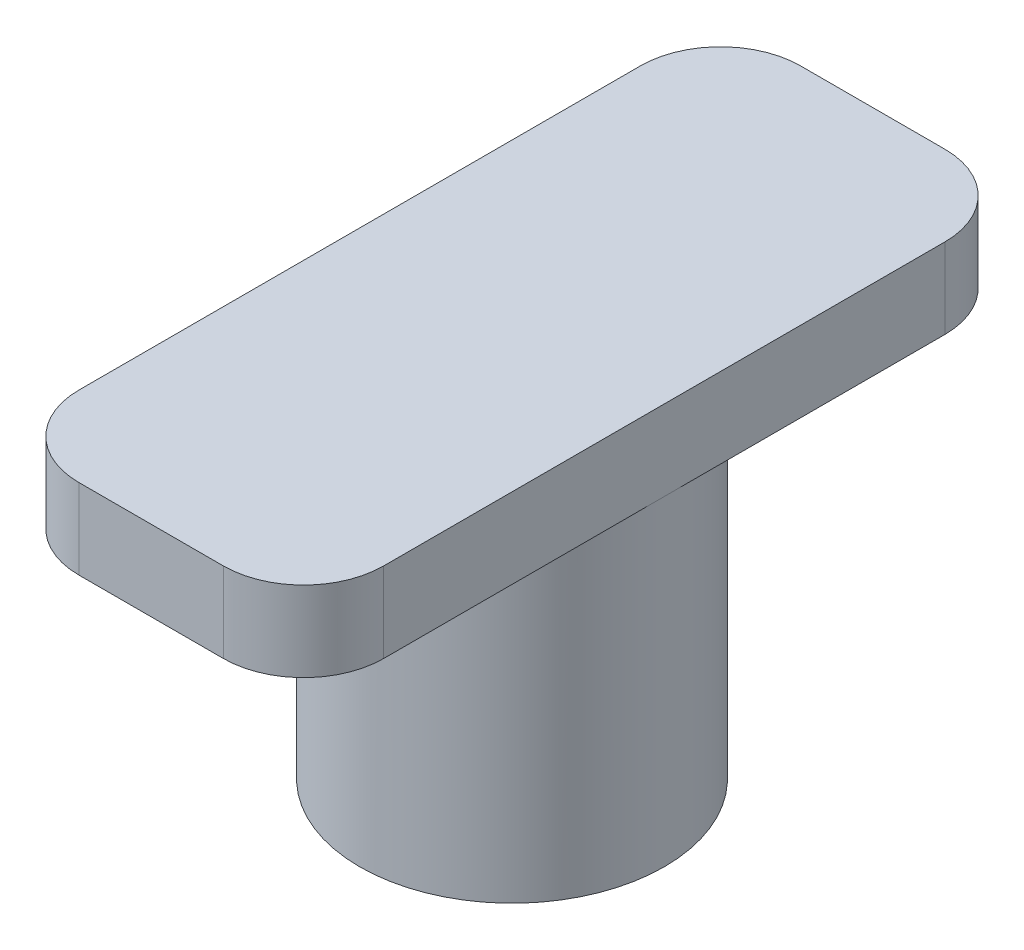
ISO-10303-21;
HEADER;
FILE_DESCRIPTION(('STEP AP214'),'2;1');
FILE_NAME('part.step','',(''),(''),'','','');
FILE_SCHEMA(('AUTOMOTIVE_DESIGN { 1 0 10303 214 1 1 1 1 }'));
ENDSEC;
DATA;
#1=APPLICATION_CONTEXT('core data for automotive mechanical design processes');
#2=APPLICATION_PROTOCOL_DEFINITION('international standard','automotive_design',2000,#1);
#3=PRODUCT_CONTEXT('',#1,'mechanical');
#4=PRODUCT('Part','Part','',(#3));
#5=PRODUCT_RELATED_PRODUCT_CATEGORY('part','',(#4));
#6=PRODUCT_DEFINITION_FORMATION('','',#4);
#7=PRODUCT_DEFINITION_CONTEXT('part definition',#1,'design');
#8=PRODUCT_DEFINITION('design','',#6,#7);
#9=PRODUCT_DEFINITION_SHAPE('','',#8);
#10=(LENGTH_UNIT() NAMED_UNIT(*) SI_UNIT(.MILLI.,.METRE.));
#11=(NAMED_UNIT(*) PLANE_ANGLE_UNIT() SI_UNIT($,.RADIAN.));
#12=(NAMED_UNIT(*) SI_UNIT($,.STERADIAN.) SOLID_ANGLE_UNIT());
#13=UNCERTAINTY_MEASURE_WITH_UNIT(LENGTH_MEASURE(1.E-05),#10,'distance_accuracy_value','');
#14=(GEOMETRIC_REPRESENTATION_CONTEXT(3) GLOBAL_UNCERTAINTY_ASSIGNED_CONTEXT((#13)) GLOBAL_UNIT_ASSIGNED_CONTEXT((#10,
#11,#12)) REPRESENTATION_CONTEXT('',''));
#15=CARTESIAN_POINT('',(0.,0.,0.));
#16=DIRECTION('',(0.,0.,1.));
#17=DIRECTION('',(1.,0.,0.));
#18=AXIS2_PLACEMENT_3D('',#15,#16,#17);
#19=CARTESIAN_POINT('',(0.,80.,0.));
#20=DIRECTION('',(0.,-1.,0.));
#21=DIRECTION('',(0.,0.,-1.));
#22=AXIS2_PLACEMENT_3D('',#19,#20,#21);
#23=CYLINDRICAL_SURFACE('',#22,38.);
#24=CARTESIAN_POINT('',(0.,80.,0.));
#25=DIRECTION('',(0.,1.,0.));
#26=DIRECTION('',(0.,0.,1.));
#27=AXIS2_PLACEMENT_3D('',#24,#25,#26);
#28=CIRCLE('',#27,38.);
#29=CARTESIAN_POINT('',(38.,80.,0.));
#30=VERTEX_POINT('',#29);
#31=CARTESIAN_POINT('',(-38.,80.,0.));
#32=VERTEX_POINT('',#31);
#33=EDGE_CURVE('E11',#30,#32,#28,.T.);
#34=ORIENTED_EDGE('',*,*,#33,.F.);
#35=EDGE_CURVE('E41',#32,#30,#28,.T.);
#36=ORIENTED_EDGE('',*,*,#35,.F.);
#37=EDGE_LOOP('',(#34,#36));
#38=FACE_BOUND('',#37,.T.);
#39=CARTESIAN_POINT('',(0.,0.,0.));
#40=DIRECTION('',(0.,1.,0.));
#41=DIRECTION('',(0.,0.,1.));
#42=AXIS2_PLACEMENT_3D('',#39,#40,#41);
#43=CIRCLE('',#42,38.);
#44=CARTESIAN_POINT('',(0.,0.,38.));
#45=VERTEX_POINT('',#44);
#46=EDGE_CURVE('E36',#45,#45,#43,.T.);
#47=ORIENTED_EDGE('',*,*,#46,.T.);
#48=EDGE_LOOP('',(#47));
#49=FACE_BOUND('',#48,.T.);
#50=ADVANCED_FACE('F33',(#38,#49),#23,.T.);
#51=CARTESIAN_POINT('',(0.,0.,0.));
#52=DIRECTION('',(0.,1.,0.));
#53=DIRECTION('',(0.,0.,1.));
#54=AXIS2_PLACEMENT_3D('',#51,#52,#53);
#55=PLANE('',#54);
#56=CARTESIAN_POINT('',(0.,0.,0.));
#57=DIRECTION('',(0.,-1.,0.));
#58=DIRECTION('',(0.,0.,-1.));
#59=AXIS2_PLACEMENT_3D('',#56,#57,#58);
#60=CIRCLE('',#59,29.);
#61=CARTESIAN_POINT('',(0.,0.,-29.));
#62=VERTEX_POINT('',#61);
#63=EDGE_CURVE('E124',#62,#62,#60,.T.);
#64=ORIENTED_EDGE('',*,*,#63,.F.);
#65=EDGE_LOOP('',(#64));
#66=FACE_BOUND('',#65,.T.);
#67=ORIENTED_EDGE('',*,*,#46,.F.);
#68=EDGE_LOOP('',(#67));
#69=FACE_BOUND('',#68,.T.);
#70=ADVANCED_FACE('F222',(#66,#69),#55,.F.);
#71=CARTESIAN_POINT('',(0.,75.,0.));
#72=DIRECTION('',(0.,-1.,0.));
#73=DIRECTION('',(0.,0.,-1.));
#74=AXIS2_PLACEMENT_3D('',#71,#72,#73);
#75=CYLINDRICAL_SURFACE('',#74,29.);
#76=CARTESIAN_POINT('',(0.,75.,0.));
#77=DIRECTION('',(0.,-1.,0.));
#78=DIRECTION('',(0.,0.,-1.));
#79=AXIS2_PLACEMENT_3D('',#76,#77,#78);
#80=CIRCLE('',#79,29.);
#81=CARTESIAN_POINT('',(0.,75.,-29.));
#82=VERTEX_POINT('',#81);
#83=EDGE_CURVE('E127',#82,#82,#80,.T.);
#84=ORIENTED_EDGE('',*,*,#83,.F.);
#85=EDGE_LOOP('',(#84));
#86=FACE_BOUND('',#85,.T.);
#87=ORIENTED_EDGE('',*,*,#63,.T.);
#88=EDGE_LOOP('',(#87));
#89=FACE_BOUND('',#88,.T.);
#90=ADVANCED_FACE('F226',(#86,#89),#75,.F.);
#91=CARTESIAN_POINT('',(0.,75.,0.));
#92=DIRECTION('',(0.,-1.,0.));
#93=DIRECTION('',(0.,0.,-1.));
#94=AXIS2_PLACEMENT_3D('',#91,#92,#93);
#95=PLANE('',#94);
#96=ORIENTED_EDGE('',*,*,#83,.T.);
#97=EDGE_LOOP('',(#96));
#98=FACE_BOUND('',#97,.T.);
#99=ADVANCED_FACE('F231',(#98),#95,.T.);
#100=CARTESIAN_POINT('',(18.,80.,70.));
#101=DIRECTION('',(0.,1.,0.));
#102=DIRECTION('',(0.,0.,1.));
#103=AXIS2_PLACEMENT_3D('',#100,#101,#102);
#104=PLANE('',#103);
#105=DIRECTION('',(0.,0.,-1.));
#106=VECTOR('',#105,1.);
#107=CARTESIAN_POINT('',(38.,80.,70.));
#108=LINE('',#107,#106);
#109=CARTESIAN_POINT('',(38.,80.,-70.));
#110=VERTEX_POINT('',#109);
#111=EDGE_CURVE('E149',#30,#110,#108,.T.);
#112=ORIENTED_EDGE('',*,*,#111,.F.);
#113=ORIENTED_EDGE('',*,*,#33,.T.);
#114=DIRECTION('',(0.,0.,-1.));
#115=VECTOR('',#114,1.);
#116=CARTESIAN_POINT('',(-38.,80.,70.));
#117=LINE('',#116,#115);
#118=CARTESIAN_POINT('',(-38.,80.,-70.));
#119=VERTEX_POINT('',#118);
#120=EDGE_CURVE('E164',#32,#119,#117,.T.);
#121=ORIENTED_EDGE('',*,*,#120,.T.);
#122=CARTESIAN_POINT('',(-18.,80.,-70.));
#123=DIRECTION('',(0.,1.,0.));
#124=DIRECTION('',(0.,0.,1.));
#125=AXIS2_PLACEMENT_3D('',#122,#123,#124);
#126=CIRCLE('',#125,20.);
#127=CARTESIAN_POINT('',(-18.,80.,-90.));
#128=VERTEX_POINT('',#127);
#129=EDGE_CURVE('E161',#128,#119,#126,.T.);
#130=ORIENTED_EDGE('',*,*,#129,.F.);
#131=DIRECTION('',(-1.,0.,0.));
#132=VECTOR('',#131,1.);
#133=CARTESIAN_POINT('',(18.,80.,-90.));
#134=LINE('',#133,#132);
#135=CARTESIAN_POINT('',(18.,80.,-90.));
#136=VERTEX_POINT('',#135);
#137=EDGE_CURVE('E155',#136,#128,#134,.T.);
#138=ORIENTED_EDGE('',*,*,#137,.F.);
#139=CARTESIAN_POINT('',(18.,80.,-70.));
#140=DIRECTION('',(0.,1.,0.));
#141=DIRECTION('',(0.,0.,1.));
#142=AXIS2_PLACEMENT_3D('',#139,#140,#141);
#143=CIRCLE('',#142,20.);
#144=EDGE_CURVE('E153',#110,#136,#143,.T.);
#145=ORIENTED_EDGE('',*,*,#144,.F.);
#146=EDGE_LOOP('',(#112,#113,#121,#130,#138,#145));
#147=FACE_BOUND('',#146,.T.);
#148=ADVANCED_FACE('F150',(#147),#104,.F.);
#149=CARTESIAN_POINT('',(-38.,80.,70.));
#150=VERTEX_POINT('',#149);
#151=EDGE_CURVE('E146',#150,#32,#117,.T.);
#152=ORIENTED_EDGE('',*,*,#151,.T.);
#153=ORIENTED_EDGE('',*,*,#35,.T.);
#154=CARTESIAN_POINT('',(38.,80.,70.));
#155=VERTEX_POINT('',#154);
#156=EDGE_CURVE('E143',#155,#30,#108,.T.);
#157=ORIENTED_EDGE('',*,*,#156,.F.);
#158=CARTESIAN_POINT('',(18.,80.,70.));
#159=DIRECTION('',(0.,1.,0.));
#160=DIRECTION('',(0.,0.,1.));
#161=AXIS2_PLACEMENT_3D('',#158,#159,#160);
#162=CIRCLE('',#161,20.);
#163=CARTESIAN_POINT('',(18.,80.,90.));
#164=VERTEX_POINT('',#163);
#165=EDGE_CURVE('E123',#164,#155,#162,.T.);
#166=ORIENTED_EDGE('',*,*,#165,.F.);
#167=DIRECTION('',(-1.,0.,0.));
#168=VECTOR('',#167,1.);
#169=CARTESIAN_POINT('',(18.,80.,90.));
#170=LINE('',#169,#168);
#171=CARTESIAN_POINT('',(-18.,80.,90.));
#172=VERTEX_POINT('',#171);
#173=EDGE_CURVE('E119',#164,#172,#170,.T.);
#174=ORIENTED_EDGE('',*,*,#173,.T.);
#175=CARTESIAN_POINT('',(-18.,80.,70.));
#176=DIRECTION('',(0.,-1.,0.));
#177=DIRECTION('',(0.,0.,-1.));
#178=AXIS2_PLACEMENT_3D('',#175,#176,#177);
#179=CIRCLE('',#178,20.);
#180=EDGE_CURVE('E166',#172,#150,#179,.T.);
#181=ORIENTED_EDGE('',*,*,#180,.T.);
#182=EDGE_LOOP('',(#152,#153,#157,#166,#174,#181));
#183=FACE_BOUND('',#182,.T.);
#184=ADVANCED_FACE('F142',(#183),#104,.F.);
#185=CARTESIAN_POINT('',(18.,100.,70.));
#186=DIRECTION('',(0.,-1.,0.));
#187=DIRECTION('',(0.,0.,-1.));
#188=AXIS2_PLACEMENT_3D('',#185,#186,#187);
#189=CYLINDRICAL_SURFACE('',#188,20.);
#190=ORIENTED_EDGE('',*,*,#165,.T.);
#191=DIRECTION('',(0.,-1.,0.));
#192=VECTOR('',#191,1.);
#193=CARTESIAN_POINT('',(38.,100.,70.));
#194=LINE('',#193,#192);
#195=CARTESIAN_POINT('',(38.,100.,70.));
#196=VERTEX_POINT('',#195);
#197=EDGE_CURVE('E103',#196,#155,#194,.T.);
#198=ORIENTED_EDGE('',*,*,#197,.F.);
#199=CARTESIAN_POINT('',(18.,100.,70.));
#200=DIRECTION('',(0.,1.,0.));
#201=DIRECTION('',(0.,0.,1.));
#202=AXIS2_PLACEMENT_3D('',#199,#200,#201);
#203=CIRCLE('',#202,20.);
#204=CARTESIAN_POINT('',(18.,100.,90.));
#205=VERTEX_POINT('',#204);
#206=EDGE_CURVE('E110',#205,#196,#203,.T.);
#207=ORIENTED_EDGE('',*,*,#206,.F.);
#208=DIRECTION('',(0.,-1.,0.));
#209=VECTOR('',#208,1.);
#210=CARTESIAN_POINT('',(18.,100.,90.));
#211=LINE('',#210,#209);
#212=EDGE_CURVE('E170',#205,#164,#211,.T.);
#213=ORIENTED_EDGE('',*,*,#212,.T.);
#214=EDGE_LOOP('',(#190,#198,#207,#213));
#215=FACE_BOUND('',#214,.T.);
#216=ADVANCED_FACE('F121',(#215),#189,.T.);
#217=CARTESIAN_POINT('',(38.,100.,70.));
#218=DIRECTION('',(-1.,0.,0.));
#219=DIRECTION('',(0.,0.,1.));
#220=AXIS2_PLACEMENT_3D('',#217,#218,#219);
#221=PLANE('',#220);
#222=ORIENTED_EDGE('',*,*,#156,.T.);
#223=ORIENTED_EDGE('',*,*,#111,.T.);
#224=DIRECTION('',(0.,-1.,0.));
#225=VECTOR('',#224,1.);
#226=CARTESIAN_POINT('',(38.,100.,-70.));
#227=LINE('',#226,#225);
#228=CARTESIAN_POINT('',(38.,100.,-70.));
#229=VERTEX_POINT('',#228);
#230=EDGE_CURVE('E106',#229,#110,#227,.T.);
#231=ORIENTED_EDGE('',*,*,#230,.F.);
#232=DIRECTION('',(0.,0.,-1.));
#233=VECTOR('',#232,1.);
#234=CARTESIAN_POINT('',(38.,100.,70.));
#235=LINE('',#234,#233);
#236=EDGE_CURVE('E98',#196,#229,#235,.T.);
#237=ORIENTED_EDGE('',*,*,#236,.F.);
#238=ORIENTED_EDGE('',*,*,#197,.T.);
#239=EDGE_LOOP('',(#222,#223,#231,#237,#238));
#240=FACE_BOUND('',#239,.T.);
#241=ADVANCED_FACE('F101',(#240),#221,.F.);
#242=CARTESIAN_POINT('',(18.,100.,-70.));
#243=DIRECTION('',(0.,-1.,0.));
#244=DIRECTION('',(0.,0.,-1.));
#245=AXIS2_PLACEMENT_3D('',#242,#243,#244);
#246=CYLINDRICAL_SURFACE('',#245,20.);
#247=ORIENTED_EDGE('',*,*,#144,.T.);
#248=DIRECTION('',(0.,-1.,0.));
#249=VECTOR('',#248,1.);
#250=CARTESIAN_POINT('',(18.,100.,-90.));
#251=LINE('',#250,#249);
#252=CARTESIAN_POINT('',(18.,100.,-90.));
#253=VERTEX_POINT('',#252);
#254=EDGE_CURVE('E129',#253,#136,#251,.T.);
#255=ORIENTED_EDGE('',*,*,#254,.F.);
#256=CARTESIAN_POINT('',(18.,100.,-70.));
#257=DIRECTION('',(0.,1.,0.));
#258=DIRECTION('',(0.,0.,1.));
#259=AXIS2_PLACEMENT_3D('',#256,#257,#258);
#260=CIRCLE('',#259,20.);
#261=EDGE_CURVE('E109',#229,#253,#260,.T.);
#262=ORIENTED_EDGE('',*,*,#261,.F.);
#263=ORIENTED_EDGE('',*,*,#230,.T.);
#264=EDGE_LOOP('',(#247,#255,#262,#263));
#265=FACE_BOUND('',#264,.T.);
#266=ADVANCED_FACE('F243',(#265),#246,.T.);
#267=CARTESIAN_POINT('',(18.,100.,-90.));
#268=DIRECTION('',(0.,0.,1.));
#269=DIRECTION('',(1.,0.,0.));
#270=AXIS2_PLACEMENT_3D('',#267,#268,#269);
#271=PLANE('',#270);
#272=ORIENTED_EDGE('',*,*,#137,.T.);
#273=DIRECTION('',(0.,-1.,0.));
#274=VECTOR('',#273,1.);
#275=CARTESIAN_POINT('',(-18.,100.,-90.));
#276=LINE('',#275,#274);
#277=CARTESIAN_POINT('',(-18.,100.,-90.));
#278=VERTEX_POINT('',#277);
#279=EDGE_CURVE('E179',#278,#128,#276,.T.);
#280=ORIENTED_EDGE('',*,*,#279,.F.);
#281=DIRECTION('',(-1.,0.,0.));
#282=VECTOR('',#281,1.);
#283=CARTESIAN_POINT('',(18.,100.,-90.));
#284=LINE('',#283,#282);
#285=EDGE_CURVE('E187',#253,#278,#284,.T.);
#286=ORIENTED_EDGE('',*,*,#285,.F.);
#287=ORIENTED_EDGE('',*,*,#254,.T.);
#288=EDGE_LOOP('',(#272,#280,#286,#287));
#289=FACE_BOUND('',#288,.T.);
#290=ADVANCED_FACE('F185',(#289),#271,.F.);
#291=CARTESIAN_POINT('',(-18.,100.,-70.));
#292=DIRECTION('',(0.,-1.,0.));
#293=DIRECTION('',(0.,0.,-1.));
#294=AXIS2_PLACEMENT_3D('',#291,#292,#293);
#295=CYLINDRICAL_SURFACE('',#294,20.);
#296=ORIENTED_EDGE('',*,*,#129,.T.);
#297=DIRECTION('',(0.,-1.,0.));
#298=VECTOR('',#297,1.);
#299=CARTESIAN_POINT('',(-38.,100.,-70.));
#300=LINE('',#299,#298);
#301=CARTESIAN_POINT('',(-38.,100.,-70.));
#302=VERTEX_POINT('',#301);
#303=EDGE_CURVE('E176',#302,#119,#300,.T.);
#304=ORIENTED_EDGE('',*,*,#303,.F.);
#305=CARTESIAN_POINT('',(-18.,100.,-70.));
#306=DIRECTION('',(0.,1.,0.));
#307=DIRECTION('',(0.,0.,1.));
#308=AXIS2_PLACEMENT_3D('',#305,#306,#307);
#309=CIRCLE('',#308,20.);
#310=EDGE_CURVE('E195',#278,#302,#309,.T.);
#311=ORIENTED_EDGE('',*,*,#310,.F.);
#312=ORIENTED_EDGE('',*,*,#279,.T.);
#313=EDGE_LOOP('',(#296,#304,#311,#312));
#314=FACE_BOUND('',#313,.T.);
#315=ADVANCED_FACE('F192',(#314),#295,.T.);
#316=CARTESIAN_POINT('',(-38.,100.,70.));
#317=DIRECTION('',(-1.,0.,0.));
#318=DIRECTION('',(0.,0.,1.));
#319=AXIS2_PLACEMENT_3D('',#316,#317,#318);
#320=PLANE('',#319);
#321=ORIENTED_EDGE('',*,*,#151,.F.);
#322=DIRECTION('',(0.,-1.,0.));
#323=VECTOR('',#322,1.);
#324=CARTESIAN_POINT('',(-38.,100.,70.));
#325=LINE('',#324,#323);
#326=CARTESIAN_POINT('',(-38.,100.,70.));
#327=VERTEX_POINT('',#326);
#328=EDGE_CURVE('E174',#327,#150,#325,.T.);
#329=ORIENTED_EDGE('',*,*,#328,.F.);
#330=DIRECTION('',(0.,0.,-1.));
#331=VECTOR('',#330,1.);
#332=CARTESIAN_POINT('',(-38.,100.,70.));
#333=LINE('',#332,#331);
#334=EDGE_CURVE('E197',#327,#302,#333,.T.);
#335=ORIENTED_EDGE('',*,*,#334,.T.);
#336=ORIENTED_EDGE('',*,*,#303,.T.);
#337=ORIENTED_EDGE('',*,*,#120,.F.);
#338=EDGE_LOOP('',(#321,#329,#335,#336,#337));
#339=FACE_BOUND('',#338,.T.);
#340=ADVANCED_FACE('F212',(#339),#320,.T.);
#341=CARTESIAN_POINT('',(-18.,100.,70.));
#342=DIRECTION('',(0.,-1.,0.));
#343=DIRECTION('',(0.,0.,-1.));
#344=AXIS2_PLACEMENT_3D('',#341,#342,#343);
#345=CYLINDRICAL_SURFACE('',#344,20.);
#346=ORIENTED_EDGE('',*,*,#180,.F.);
#347=DIRECTION('',(0.,-1.,0.));
#348=VECTOR('',#347,1.);
#349=CARTESIAN_POINT('',(-18.,100.,90.));
#350=LINE('',#349,#348);
#351=CARTESIAN_POINT('',(-18.,100.,90.));
#352=VERTEX_POINT('',#351);
#353=EDGE_CURVE('E172',#352,#172,#350,.T.);
#354=ORIENTED_EDGE('',*,*,#353,.F.);
#355=CARTESIAN_POINT('',(-18.,100.,70.));
#356=DIRECTION('',(0.,-1.,0.));
#357=DIRECTION('',(0.,0.,-1.));
#358=AXIS2_PLACEMENT_3D('',#355,#356,#357);
#359=CIRCLE('',#358,20.);
#360=EDGE_CURVE('E199',#352,#327,#359,.T.);
#361=ORIENTED_EDGE('',*,*,#360,.T.);
#362=ORIENTED_EDGE('',*,*,#328,.T.);
#363=EDGE_LOOP('',(#346,#354,#361,#362));
#364=FACE_BOUND('',#363,.T.);
#365=ADVANCED_FACE('F210',(#364),#345,.T.);
#366=CARTESIAN_POINT('',(18.,100.,90.));
#367=DIRECTION('',(0.,0.,1.));
#368=DIRECTION('',(1.,0.,0.));
#369=AXIS2_PLACEMENT_3D('',#366,#367,#368);
#370=PLANE('',#369);
#371=ORIENTED_EDGE('',*,*,#173,.F.);
#372=ORIENTED_EDGE('',*,*,#212,.F.);
#373=DIRECTION('',(-1.,0.,0.));
#374=VECTOR('',#373,1.);
#375=CARTESIAN_POINT('',(18.,100.,90.));
#376=LINE('',#375,#374);
#377=EDGE_CURVE('E117',#205,#352,#376,.T.);
#378=ORIENTED_EDGE('',*,*,#377,.T.);
#379=ORIENTED_EDGE('',*,*,#353,.T.);
#380=EDGE_LOOP('',(#371,#372,#378,#379));
#381=FACE_BOUND('',#380,.T.);
#382=ADVANCED_FACE('F207',(#381),#370,.T.);
#383=CARTESIAN_POINT('',(18.,100.,70.));
#384=DIRECTION('',(0.,1.,0.));
#385=DIRECTION('',(0.,0.,1.));
#386=AXIS2_PLACEMENT_3D('',#383,#384,#385);
#387=PLANE('',#386);
#388=ORIENTED_EDGE('',*,*,#206,.T.);
#389=ORIENTED_EDGE('',*,*,#236,.T.);
#390=ORIENTED_EDGE('',*,*,#261,.T.);
#391=ORIENTED_EDGE('',*,*,#285,.T.);
#392=ORIENTED_EDGE('',*,*,#310,.T.);
#393=ORIENTED_EDGE('',*,*,#334,.F.);
#394=ORIENTED_EDGE('',*,*,#360,.F.);
#395=ORIENTED_EDGE('',*,*,#377,.F.);
#396=EDGE_LOOP('',(#388,#389,#390,#391,#392,#393,#394,#395));
#397=FACE_BOUND('',#396,.T.);
#398=ADVANCED_FACE('F114',(#397),#387,.T.);
#399=CLOSED_SHELL('',(#50,#70,#90,#99,#148,#184,#216,#241,#266,#290,#315,#340,#365,#382,#398));
#400=MANIFOLD_SOLID_BREP('B2',#399);
#401=ADVANCED_BREP_SHAPE_REPRESENTATION('',(#18,#400),#14);
#402=SHAPE_DEFINITION_REPRESENTATION(#9,#401);
ENDSEC;
END-ISO-10303-21;
